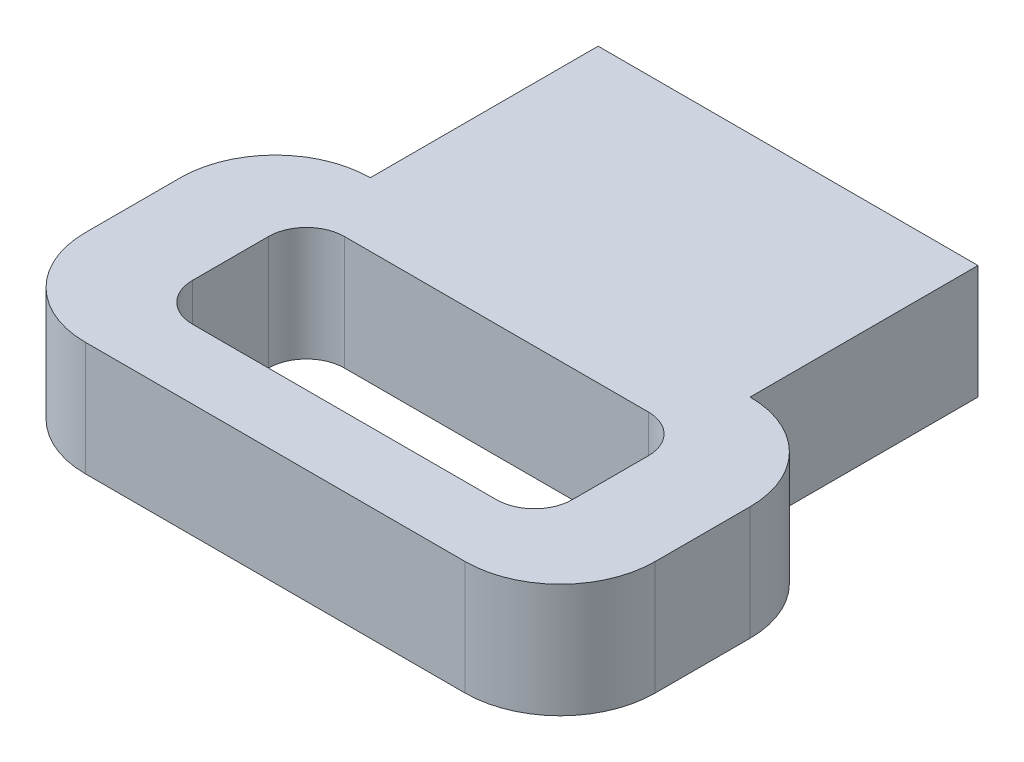
ISO-10303-21;
HEADER;
FILE_DESCRIPTION(('STEP AP214'),'2;1');
FILE_NAME('part.step','',(''),(''),'','','');
FILE_SCHEMA(('AUTOMOTIVE_DESIGN { 1 0 10303 214 1 1 1 1 }'));
ENDSEC;
DATA;
#1=APPLICATION_CONTEXT('core data for automotive mechanical design processes');
#2=APPLICATION_PROTOCOL_DEFINITION('international standard','automotive_design',2000,#1);
#3=PRODUCT_CONTEXT('',#1,'mechanical');
#4=PRODUCT('Part','Part','',(#3));
#5=PRODUCT_RELATED_PRODUCT_CATEGORY('part','',(#4));
#6=PRODUCT_DEFINITION_FORMATION('','',#4);
#7=PRODUCT_DEFINITION_CONTEXT('part definition',#1,'design');
#8=PRODUCT_DEFINITION('design','',#6,#7);
#9=PRODUCT_DEFINITION_SHAPE('','',#8);
#10=(LENGTH_UNIT() NAMED_UNIT(*) SI_UNIT(.MILLI.,.METRE.));
#11=(NAMED_UNIT(*) PLANE_ANGLE_UNIT() SI_UNIT($,.RADIAN.));
#12=(NAMED_UNIT(*) SI_UNIT($,.STERADIAN.) SOLID_ANGLE_UNIT());
#13=UNCERTAINTY_MEASURE_WITH_UNIT(LENGTH_MEASURE(1.E-05),#10,'distance_accuracy_value','');
#14=(GEOMETRIC_REPRESENTATION_CONTEXT(3) GLOBAL_UNCERTAINTY_ASSIGNED_CONTEXT((#13)) GLOBAL_UNIT_ASSIGNED_CONTEXT((#10,
#11,#12)) REPRESENTATION_CONTEXT('',''));
#15=CARTESIAN_POINT('',(0.,0.,0.));
#16=DIRECTION('',(0.,0.,1.));
#17=DIRECTION('',(1.,0.,0.));
#18=AXIS2_PLACEMENT_3D('',#15,#16,#17);
#19=CARTESIAN_POINT('',(-25.4,-7.62,30.48));
#20=DIRECTION('',(1.,0.,0.));
#21=DIRECTION('',(0.,0.,-1.));
#22=AXIS2_PLACEMENT_3D('',#19,#20,#21);
#23=PLANE('',#22);
#24=DIRECTION('',(0.,-1.,0.));
#25=VECTOR('',#24,1.);
#26=CARTESIAN_POINT('',(-25.4,-7.62,0.));
#27=LINE('',#26,#25);
#28=CARTESIAN_POINT('',(-25.4,7.62,0.));
#29=VERTEX_POINT('',#28);
#30=CARTESIAN_POINT('',(-25.4,-7.62,0.));
#31=VERTEX_POINT('',#30);
#32=EDGE_CURVE('E203',#29,#31,#27,.T.);
#33=ORIENTED_EDGE('',*,*,#32,.T.);
#34=DIRECTION('',(0.,0.,-1.));
#35=VECTOR('',#34,1.);
#36=CARTESIAN_POINT('',(-25.4,-7.62,30.48));
#37=LINE('',#36,#35);
#38=CARTESIAN_POINT('',(-25.4,-7.62,30.48));
#39=VERTEX_POINT('',#38);
#40=EDGE_CURVE('E211',#39,#31,#37,.T.);
#41=ORIENTED_EDGE('',*,*,#40,.F.);
#42=DIRECTION('',(0.,-1.,0.));
#43=VECTOR('',#42,1.);
#44=CARTESIAN_POINT('',(-25.4,-7.62,30.48));
#45=LINE('',#44,#43);
#46=CARTESIAN_POINT('',(-25.4,7.62,30.48));
#47=VERTEX_POINT('',#46);
#48=EDGE_CURVE('E195',#47,#39,#45,.T.);
#49=ORIENTED_EDGE('',*,*,#48,.F.);
#50=DIRECTION('',(0.,0.,-1.));
#51=VECTOR('',#50,1.);
#52=CARTESIAN_POINT('',(-25.4,7.62,30.48));
#53=LINE('',#52,#51);
#54=EDGE_CURVE('E191',#47,#29,#53,.T.);
#55=ORIENTED_EDGE('',*,*,#54,.T.);
#56=EDGE_LOOP('',(#33,#41,#49,#55));
#57=FACE_BOUND('',#56,.T.);
#58=ADVANCED_FACE('F43',(#57),#23,.F.);
#59=CARTESIAN_POINT('',(25.4,-7.61999999999999,30.48));
#60=DIRECTION('',(0.,1.,0.));
#61=DIRECTION('',(-1.,0.,0.));
#62=AXIS2_PLACEMENT_3D('',#59,#60,#61);
#63=PLANE('',#62);
#64=DIRECTION('',(1.,0.,0.));
#65=VECTOR('',#64,1.);
#66=CARTESIAN_POINT('',(-25.4,-7.62,39.0072628806336));
#67=LINE('',#66,#65);
#68=CARTESIAN_POINT('',(-20.32,-7.62,39.0072628806336));
#69=VERTEX_POINT('',#68);
#70=CARTESIAN_POINT('',(20.32,-7.61999999999999,39.0072628806336));
#71=VERTEX_POINT('',#70);
#72=EDGE_CURVE('E553',#69,#71,#67,.T.);
#73=ORIENTED_EDGE('',*,*,#72,.F.);
#74=CARTESIAN_POINT('',(-20.32,-7.61999999999999,44.0872628806336));
#75=DIRECTION('',(0.,1.,0.));
#76=DIRECTION('',(-1.,0.,0.));
#77=AXIS2_PLACEMENT_3D('',#74,#75,#76);
#78=CIRCLE('',#77,5.08);
#79=CARTESIAN_POINT('',(-25.4,-7.62,44.0872628806336));
#80=VERTEX_POINT('',#79);
#81=EDGE_CURVE('E238',#69,#80,#78,.T.);
#82=ORIENTED_EDGE('',*,*,#81,.T.);
#83=DIRECTION('',(0.,0.,-1.));
#84=VECTOR('',#83,1.);
#85=CARTESIAN_POINT('',(-25.4,-7.62,59.3272628806336));
#86=LINE('',#85,#84);
#87=CARTESIAN_POINT('',(-25.4,-7.62,54.2472628806336));
#88=VERTEX_POINT('',#87);
#89=EDGE_CURVE('E547',#88,#80,#86,.T.);
#90=ORIENTED_EDGE('',*,*,#89,.F.);
#91=CARTESIAN_POINT('',(-20.32,-7.61999999999999,54.2472628806336));
#92=DIRECTION('',(0.,1.,0.));
#93=DIRECTION('',(-1.,0.,0.));
#94=AXIS2_PLACEMENT_3D('',#91,#92,#93);
#95=CIRCLE('',#94,5.08);
#96=CARTESIAN_POINT('',(-20.32,-7.62,59.3272628806336));
#97=VERTEX_POINT('',#96);
#98=EDGE_CURVE('E246',#88,#97,#95,.T.);
#99=ORIENTED_EDGE('',*,*,#98,.T.);
#100=DIRECTION('',(1.,0.,0.));
#101=VECTOR('',#100,1.);
#102=CARTESIAN_POINT('',(-25.4,-7.62,59.3272628806336));
#103=LINE('',#102,#101);
#104=CARTESIAN_POINT('',(20.32,-7.61999999999999,59.3272628806336));
#105=VERTEX_POINT('',#104);
#106=EDGE_CURVE('E561',#97,#105,#103,.T.);
#107=ORIENTED_EDGE('',*,*,#106,.T.);
#108=CARTESIAN_POINT('',(20.32,-7.61999999999999,54.2472628806336));
#109=DIRECTION('',(0.,1.,0.));
#110=DIRECTION('',(-1.,0.,0.));
#111=AXIS2_PLACEMENT_3D('',#108,#109,#110);
#112=CIRCLE('',#111,5.08);
#113=CARTESIAN_POINT('',(25.4,-7.61999999999999,54.2472628806336));
#114=VERTEX_POINT('',#113);
#115=EDGE_CURVE('E242',#105,#114,#112,.T.);
#116=ORIENTED_EDGE('',*,*,#115,.T.);
#117=DIRECTION('',(0.,0.,-1.));
#118=VECTOR('',#117,1.);
#119=CARTESIAN_POINT('',(25.4,-7.61999999999999,59.3272628806336));
#120=LINE('',#119,#118);
#121=CARTESIAN_POINT('',(25.4,-7.61999999999999,44.0872628806336));
#122=VERTEX_POINT('',#121);
#123=EDGE_CURVE('E556',#114,#122,#120,.T.);
#124=ORIENTED_EDGE('',*,*,#123,.T.);
#125=CARTESIAN_POINT('',(20.32,-7.61999999999999,44.0872628806336));
#126=DIRECTION('',(0.,1.,0.));
#127=DIRECTION('',(-1.,0.,0.));
#128=AXIS2_PLACEMENT_3D('',#125,#126,#127);
#129=CIRCLE('',#128,5.08);
#130=EDGE_CURVE('E234',#122,#71,#129,.T.);
#131=ORIENTED_EDGE('',*,*,#130,.T.);
#132=EDGE_LOOP('',(#73,#82,#90,#99,#107,#116,#124,#131));
#133=FACE_BOUND('',#132,.T.);
#134=DIRECTION('',(0.,0.,-1.));
#135=VECTOR('',#134,1.);
#136=CARTESIAN_POINT('',(25.4,-7.61999999999999,30.48));
#137=LINE('',#136,#135);
#138=CARTESIAN_POINT('',(25.4,-7.61999999999999,30.48));
#139=VERTEX_POINT('',#138);
#140=CARTESIAN_POINT('',(25.4,-7.61999999999999,0.));
#141=VERTEX_POINT('',#140);
#142=EDGE_CURVE('E190',#139,#141,#137,.T.);
#143=ORIENTED_EDGE('',*,*,#142,.F.);
#144=CARTESIAN_POINT('',(25.4,-7.61999999999999,43.18));
#145=DIRECTION('',(0.,1.,0.));
#146=DIRECTION('',(-1.,0.,0.));
#147=AXIS2_PLACEMENT_3D('',#144,#145,#146);
#148=CIRCLE('',#147,12.7);
#149=CARTESIAN_POINT('',(38.1,-7.62000000000001,43.18));
#150=VERTEX_POINT('',#149);
#151=EDGE_CURVE('E194',#139,#150,#148,.F.);
#152=ORIENTED_EDGE('',*,*,#151,.T.);
#153=DIRECTION('',(0.,0.,-1.));
#154=VECTOR('',#153,1.);
#155=CARTESIAN_POINT('',(38.1,-7.62000000000001,68.58));
#156=LINE('',#155,#154);
#157=CARTESIAN_POINT('',(38.1,-7.62000000000001,55.88));
#158=VERTEX_POINT('',#157);
#159=EDGE_CURVE('E292',#158,#150,#156,.T.);
#160=ORIENTED_EDGE('',*,*,#159,.F.);
#161=CARTESIAN_POINT('',(25.4,-7.61999999999999,55.88));
#162=DIRECTION('',(0.,1.,0.));
#163=DIRECTION('',(-1.,0.,0.));
#164=AXIS2_PLACEMENT_3D('',#161,#162,#163);
#165=CIRCLE('',#164,12.7);
#166=CARTESIAN_POINT('',(25.4,-7.62000000000001,68.58));
#167=VERTEX_POINT('',#166);
#168=EDGE_CURVE('E261',#158,#167,#165,.F.);
#169=ORIENTED_EDGE('',*,*,#168,.T.);
#170=DIRECTION('',(1.,0.,0.));
#171=VECTOR('',#170,1.);
#172=CARTESIAN_POINT('',(-38.1,-7.62000000000001,68.58));
#173=LINE('',#172,#171);
#174=CARTESIAN_POINT('',(-25.4,-7.62000000000001,68.58));
#175=VERTEX_POINT('',#174);
#176=EDGE_CURVE('E286',#175,#167,#173,.T.);
#177=ORIENTED_EDGE('',*,*,#176,.F.);
#178=CARTESIAN_POINT('',(-25.4,-7.62,55.88));
#179=DIRECTION('',(0.,1.,0.));
#180=DIRECTION('',(-1.,0.,0.));
#181=AXIS2_PLACEMENT_3D('',#178,#179,#180);
#182=CIRCLE('',#181,12.7);
#183=CARTESIAN_POINT('',(-38.1,-7.62000000000001,55.88));
#184=VERTEX_POINT('',#183);
#185=EDGE_CURVE('E65',#175,#184,#182,.F.);
#186=ORIENTED_EDGE('',*,*,#185,.T.);
#187=DIRECTION('',(0.,0.,-1.));
#188=VECTOR('',#187,1.);
#189=CARTESIAN_POINT('',(-38.1,-7.62000000000001,68.58));
#190=LINE('',#189,#188);
#191=CARTESIAN_POINT('',(-38.1,-7.62000000000001,43.18));
#192=VERTEX_POINT('',#191);
#193=EDGE_CURVE('E275',#184,#192,#190,.T.);
#194=ORIENTED_EDGE('',*,*,#193,.T.);
#195=CARTESIAN_POINT('',(-25.4,-7.62,43.18));
#196=DIRECTION('',(0.,1.,0.));
#197=DIRECTION('',(-1.,0.,0.));
#198=AXIS2_PLACEMENT_3D('',#195,#196,#197);
#199=CIRCLE('',#198,12.7);
#200=EDGE_CURVE('E58',#192,#39,#199,.F.);
#201=ORIENTED_EDGE('',*,*,#200,.T.);
#202=ORIENTED_EDGE('',*,*,#40,.T.);
#203=DIRECTION('',(1.,0.,0.));
#204=VECTOR('',#203,1.);
#205=CARTESIAN_POINT('',(25.4,-7.61999999999999,0.));
#206=LINE('',#205,#204);
#207=EDGE_CURVE('E206',#31,#141,#206,.T.);
#208=ORIENTED_EDGE('',*,*,#207,.T.);
#209=EDGE_LOOP('',(#143,#152,#160,#169,#177,#186,#194,#201,#202,#208));
#210=FACE_BOUND('',#209,.T.);
#211=ADVANCED_FACE('F289',(#133,#210),#63,.F.);
#212=CARTESIAN_POINT('',(25.4,-7.61999999999999,30.48));
#213=DIRECTION('',(-1.,0.,0.));
#214=DIRECTION('',(0.,-1.,0.));
#215=AXIS2_PLACEMENT_3D('',#212,#213,#214);
#216=PLANE('',#215);
#217=DIRECTION('',(0.,1.,0.));
#218=VECTOR('',#217,1.);
#219=CARTESIAN_POINT('',(25.4,-7.61999999999999,0.));
#220=LINE('',#219,#218);
#221=CARTESIAN_POINT('',(25.4,7.62000000000001,0.));
#222=VERTEX_POINT('',#221);
#223=EDGE_CURVE('E189',#141,#222,#220,.T.);
#224=ORIENTED_EDGE('',*,*,#223,.T.);
#225=DIRECTION('',(0.,0.,-1.));
#226=VECTOR('',#225,1.);
#227=CARTESIAN_POINT('',(25.4,7.62000000000001,30.48));
#228=LINE('',#227,#226);
#229=CARTESIAN_POINT('',(25.4,7.62000000000001,30.48));
#230=VERTEX_POINT('',#229);
#231=EDGE_CURVE('E172',#230,#222,#228,.T.);
#232=ORIENTED_EDGE('',*,*,#231,.F.);
#233=DIRECTION('',(0.,1.,0.));
#234=VECTOR('',#233,1.);
#235=CARTESIAN_POINT('',(25.4,-7.61999999999999,30.48));
#236=LINE('',#235,#234);
#237=EDGE_CURVE('E186',#139,#230,#236,.T.);
#238=ORIENTED_EDGE('',*,*,#237,.F.);
#239=ORIENTED_EDGE('',*,*,#142,.T.);
#240=EDGE_LOOP('',(#224,#232,#238,#239));
#241=FACE_BOUND('',#240,.T.);
#242=ADVANCED_FACE('F184',(#241),#216,.F.);
#243=CARTESIAN_POINT('',(25.4,7.62000000000001,30.48));
#244=DIRECTION('',(0.,-1.,0.));
#245=DIRECTION('',(1.,0.,0.));
#246=AXIS2_PLACEMENT_3D('',#243,#244,#245);
#247=PLANE('',#246);
#248=DIRECTION('',(1.,0.,0.));
#249=VECTOR('',#248,1.);
#250=CARTESIAN_POINT('',(-25.4,7.62000000000001,59.3272628806336));
#251=LINE('',#250,#249);
#252=CARTESIAN_POINT('',(-20.32,7.62000000000001,59.3272628806336));
#253=VERTEX_POINT('',#252);
#254=CARTESIAN_POINT('',(20.32,7.62000000000001,59.3272628806336));
#255=VERTEX_POINT('',#254);
#256=EDGE_CURVE('E296',#253,#255,#251,.T.);
#257=ORIENTED_EDGE('',*,*,#256,.F.);
#258=CARTESIAN_POINT('',(-20.32,7.62,54.2472628806336));
#259=DIRECTION('',(0.,-1.,0.));
#260=DIRECTION('',(1.,0.,0.));
#261=AXIS2_PLACEMENT_3D('',#258,#259,#260);
#262=CIRCLE('',#261,5.08);
#263=CARTESIAN_POINT('',(-25.4,7.62000000000001,54.2472628806336));
#264=VERTEX_POINT('',#263);
#265=EDGE_CURVE('E248',#253,#264,#262,.T.);
#266=ORIENTED_EDGE('',*,*,#265,.T.);
#267=DIRECTION('',(0.,0.,-1.));
#268=VECTOR('',#267,1.);
#269=CARTESIAN_POINT('',(-25.4,7.62000000000001,59.3272628806336));
#270=LINE('',#269,#268);
#271=CARTESIAN_POINT('',(-25.4,7.62000000000001,44.0872628806336));
#272=VERTEX_POINT('',#271);
#273=EDGE_CURVE('E549',#264,#272,#270,.T.);
#274=ORIENTED_EDGE('',*,*,#273,.T.);
#275=CARTESIAN_POINT('',(-20.32,7.62,44.0872628806336));
#276=DIRECTION('',(0.,-1.,0.));
#277=DIRECTION('',(1.,0.,0.));
#278=AXIS2_PLACEMENT_3D('',#275,#276,#277);
#279=CIRCLE('',#278,5.08);
#280=CARTESIAN_POINT('',(-20.32,7.62000000000001,39.0072628806336));
#281=VERTEX_POINT('',#280);
#282=EDGE_CURVE('E240',#272,#281,#279,.T.);
#283=ORIENTED_EDGE('',*,*,#282,.T.);
#284=DIRECTION('',(1.,0.,0.));
#285=VECTOR('',#284,1.);
#286=CARTESIAN_POINT('',(-25.4,7.62000000000001,39.0072628806336));
#287=LINE('',#286,#285);
#288=CARTESIAN_POINT('',(20.32,7.62000000000001,39.0072628806336));
#289=VERTEX_POINT('',#288);
#290=EDGE_CURVE('E562',#281,#289,#287,.T.);
#291=ORIENTED_EDGE('',*,*,#290,.T.);
#292=CARTESIAN_POINT('',(20.32,7.62000000000001,44.0872628806336));
#293=DIRECTION('',(0.,-1.,0.));
#294=DIRECTION('',(1.,0.,0.));
#295=AXIS2_PLACEMENT_3D('',#292,#293,#294);
#296=CIRCLE('',#295,5.08);
#297=CARTESIAN_POINT('',(25.4,7.62000000000001,44.0872628806336));
#298=VERTEX_POINT('',#297);
#299=EDGE_CURVE('E236',#289,#298,#296,.T.);
#300=ORIENTED_EDGE('',*,*,#299,.T.);
#301=DIRECTION('',(0.,0.,-1.));
#302=VECTOR('',#301,1.);
#303=CARTESIAN_POINT('',(25.4,7.62000000000001,59.3272628806336));
#304=LINE('',#303,#302);
#305=CARTESIAN_POINT('',(25.4,7.62000000000001,54.2472628806336));
#306=VERTEX_POINT('',#305);
#307=EDGE_CURVE('E541',#306,#298,#304,.T.);
#308=ORIENTED_EDGE('',*,*,#307,.F.);
#309=CARTESIAN_POINT('',(20.32,7.62000000000001,54.2472628806336));
#310=DIRECTION('',(0.,-1.,0.));
#311=DIRECTION('',(1.,0.,0.));
#312=AXIS2_PLACEMENT_3D('',#309,#310,#311);
#313=CIRCLE('',#312,5.08);
#314=EDGE_CURVE('E244',#306,#255,#313,.T.);
#315=ORIENTED_EDGE('',*,*,#314,.T.);
#316=EDGE_LOOP('',(#257,#266,#274,#283,#291,#300,#308,#315));
#317=FACE_BOUND('',#316,.T.);
#318=DIRECTION('',(0.,0.,-1.));
#319=VECTOR('',#318,1.);
#320=CARTESIAN_POINT('',(38.1,7.62000000000001,68.58));
#321=LINE('',#320,#319);
#322=CARTESIAN_POINT('',(38.1,7.62000000000001,55.88));
#323=VERTEX_POINT('',#322);
#324=CARTESIAN_POINT('',(38.1,7.62000000000001,43.18));
#325=VERTEX_POINT('',#324);
#326=EDGE_CURVE('E175',#323,#325,#321,.T.);
#327=ORIENTED_EDGE('',*,*,#326,.T.);
#328=CARTESIAN_POINT('',(25.4,7.62000000000001,43.18));
#329=DIRECTION('',(0.,-1.,0.));
#330=DIRECTION('',(1.,0.,0.));
#331=AXIS2_PLACEMENT_3D('',#328,#329,#330);
#332=CIRCLE('',#331,12.7);
#333=EDGE_CURVE('E169',#325,#230,#332,.F.);
#334=ORIENTED_EDGE('',*,*,#333,.T.);
#335=ORIENTED_EDGE('',*,*,#231,.T.);
#336=DIRECTION('',(-1.,0.,0.));
#337=VECTOR('',#336,1.);
#338=CARTESIAN_POINT('',(25.4,7.62000000000001,0.));
#339=LINE('',#338,#337);
#340=EDGE_CURVE('E199',#222,#29,#339,.T.);
#341=ORIENTED_EDGE('',*,*,#340,.T.);
#342=ORIENTED_EDGE('',*,*,#54,.F.);
#343=CARTESIAN_POINT('',(-25.4,7.62,43.18));
#344=DIRECTION('',(0.,-1.,0.));
#345=DIRECTION('',(1.,0.,0.));
#346=AXIS2_PLACEMENT_3D('',#343,#344,#345);
#347=CIRCLE('',#346,12.7);
#348=CARTESIAN_POINT('',(-38.1,7.62000000000001,43.18));
#349=VERTEX_POINT('',#348);
#350=EDGE_CURVE('E256',#47,#349,#347,.F.);
#351=ORIENTED_EDGE('',*,*,#350,.T.);
#352=DIRECTION('',(0.,0.,-1.));
#353=VECTOR('',#352,1.);
#354=CARTESIAN_POINT('',(-38.1,7.62000000000001,68.58));
#355=LINE('',#354,#353);
#356=CARTESIAN_POINT('',(-38.1,7.62000000000001,55.88));
#357=VERTEX_POINT('',#356);
#358=EDGE_CURVE('E274',#357,#349,#355,.T.);
#359=ORIENTED_EDGE('',*,*,#358,.F.);
#360=CARTESIAN_POINT('',(-25.4,7.62,55.88));
#361=DIRECTION('',(0.,-1.,0.));
#362=DIRECTION('',(1.,0.,0.));
#363=AXIS2_PLACEMENT_3D('',#360,#361,#362);
#364=CIRCLE('',#363,12.7);
#365=CARTESIAN_POINT('',(-25.4,7.62000000000001,68.58));
#366=VERTEX_POINT('',#365);
#367=EDGE_CURVE('E254',#357,#366,#364,.F.);
#368=ORIENTED_EDGE('',*,*,#367,.T.);
#369=DIRECTION('',(-1.,0.,0.));
#370=VECTOR('',#369,1.);
#371=CARTESIAN_POINT('',(-38.1,7.62000000000001,68.58));
#372=LINE('',#371,#370);
#373=CARTESIAN_POINT('',(25.4,7.62000000000001,68.58));
#374=VERTEX_POINT('',#373);
#375=EDGE_CURVE('E288',#374,#366,#372,.T.);
#376=ORIENTED_EDGE('',*,*,#375,.F.);
#377=CARTESIAN_POINT('',(25.4,7.62000000000001,55.88));
#378=DIRECTION('',(0.,-1.,0.));
#379=DIRECTION('',(1.,0.,0.));
#380=AXIS2_PLACEMENT_3D('',#377,#378,#379);
#381=CIRCLE('',#380,12.7);
#382=EDGE_CURVE('E180',#374,#323,#381,.F.);
#383=ORIENTED_EDGE('',*,*,#382,.T.);
#384=EDGE_LOOP('',(#327,#334,#335,#341,#342,#351,#359,#368,#376,#383));
#385=FACE_BOUND('',#384,.T.);
#386=ADVANCED_FACE('F171',(#317,#385),#247,.F.);
#387=CARTESIAN_POINT('',(0.,0.,0.));
#388=DIRECTION('',(0.,0.,1.));
#389=DIRECTION('',(1.,0.,0.));
#390=AXIS2_PLACEMENT_3D('',#387,#388,#389);
#391=PLANE('',#390);
#392=ORIENTED_EDGE('',*,*,#32,.F.);
#393=ORIENTED_EDGE('',*,*,#340,.F.);
#394=ORIENTED_EDGE('',*,*,#223,.F.);
#395=ORIENTED_EDGE('',*,*,#207,.F.);
#396=EDGE_LOOP('',(#392,#393,#394,#395));
#397=FACE_BOUND('',#396,.T.);
#398=ADVANCED_FACE('F456',(#397),#391,.F.);
#399=CARTESIAN_POINT('',(38.1,-7.62000000000001,68.58));
#400=DIRECTION('',(-1.,0.,0.));
#401=DIRECTION('',(0.,0.,1.));
#402=AXIS2_PLACEMENT_3D('',#399,#400,#401);
#403=PLANE('',#402);
#404=ORIENTED_EDGE('',*,*,#159,.T.);
#405=DIRECTION('',(0.,1.,0.));
#406=VECTOR('',#405,1.);
#407=CARTESIAN_POINT('',(38.1,7.62000000000001,43.18));
#408=LINE('',#407,#406);
#409=EDGE_CURVE('E252',#150,#325,#408,.T.);
#410=ORIENTED_EDGE('',*,*,#409,.T.);
#411=ORIENTED_EDGE('',*,*,#326,.F.);
#412=DIRECTION('',(0.,1.,0.));
#413=VECTOR('',#412,1.);
#414=CARTESIAN_POINT('',(38.1,-7.62000000000001,55.88));
#415=LINE('',#414,#413);
#416=EDGE_CURVE('E250',#323,#158,#415,.F.);
#417=ORIENTED_EDGE('',*,*,#416,.T.);
#418=EDGE_LOOP('',(#404,#410,#411,#417));
#419=FACE_BOUND('',#418,.T.);
#420=ADVANCED_FACE('F447',(#419),#403,.F.);
#421=CARTESIAN_POINT('',(-38.1,-7.62000000000001,68.58));
#422=DIRECTION('',(1.,0.,0.));
#423=DIRECTION('',(0.,0.,-1.));
#424=AXIS2_PLACEMENT_3D('',#421,#422,#423);
#425=PLANE('',#424);
#426=ORIENTED_EDGE('',*,*,#358,.T.);
#427=DIRECTION('',(0.,-1.,0.));
#428=VECTOR('',#427,1.);
#429=CARTESIAN_POINT('',(-38.1,-7.62000000000001,43.18));
#430=LINE('',#429,#428);
#431=EDGE_CURVE('E11',#349,#192,#430,.T.);
#432=ORIENTED_EDGE('',*,*,#431,.T.);
#433=ORIENTED_EDGE('',*,*,#193,.F.);
#434=DIRECTION('',(0.,-1.,0.));
#435=VECTOR('',#434,1.);
#436=CARTESIAN_POINT('',(-38.1,-7.62000000000001,55.88));
#437=LINE('',#436,#435);
#438=EDGE_CURVE('E51',#184,#357,#437,.F.);
#439=ORIENTED_EDGE('',*,*,#438,.T.);
#440=EDGE_LOOP('',(#426,#432,#433,#439));
#441=FACE_BOUND('',#440,.T.);
#442=ADVANCED_FACE('F273',(#441),#425,.F.);
#443=CARTESIAN_POINT('',(0.,0.,68.58));
#444=DIRECTION('',(0.,0.,-1.));
#445=DIRECTION('',(-1.,0.,0.));
#446=AXIS2_PLACEMENT_3D('',#443,#444,#445);
#447=PLANE('',#446);
#448=ORIENTED_EDGE('',*,*,#176,.T.);
#449=DIRECTION('',(0.,1.,0.));
#450=VECTOR('',#449,1.);
#451=CARTESIAN_POINT('',(25.4,0.,68.58));
#452=LINE('',#451,#450);
#453=EDGE_CURVE('E267',#167,#374,#452,.T.);
#454=ORIENTED_EDGE('',*,*,#453,.T.);
#455=ORIENTED_EDGE('',*,*,#375,.T.);
#456=DIRECTION('',(0.,-1.,0.));
#457=VECTOR('',#456,1.);
#458=CARTESIAN_POINT('',(-25.4,0.,68.58));
#459=LINE('',#458,#457);
#460=EDGE_CURVE('E264',#366,#175,#459,.T.);
#461=ORIENTED_EDGE('',*,*,#460,.T.);
#462=EDGE_LOOP('',(#448,#454,#455,#461));
#463=FACE_BOUND('',#462,.T.);
#464=ADVANCED_FACE('F285',(#463),#447,.F.);
#465=CARTESIAN_POINT('',(-25.4,7.62000000000001,59.3272628806336));
#466=DIRECTION('',(-1.,0.,0.));
#467=DIRECTION('',(0.,-1.,0.));
#468=AXIS2_PLACEMENT_3D('',#465,#466,#467);
#469=PLANE('',#468);
#470=ORIENTED_EDGE('',*,*,#89,.T.);
#471=DIRECTION('',(0.,-1.,0.));
#472=VECTOR('',#471,1.);
#473=CARTESIAN_POINT('',(-25.4,7.62000000000001,44.0872628806336));
#474=LINE('',#473,#472);
#475=EDGE_CURVE('E227',#80,#272,#474,.F.);
#476=ORIENTED_EDGE('',*,*,#475,.T.);
#477=ORIENTED_EDGE('',*,*,#273,.F.);
#478=DIRECTION('',(0.,-1.,0.));
#479=VECTOR('',#478,1.);
#480=CARTESIAN_POINT('',(-25.4,7.62000000000001,54.2472628806336));
#481=LINE('',#480,#479);
#482=EDGE_CURVE('E224',#264,#88,#481,.T.);
#483=ORIENTED_EDGE('',*,*,#482,.T.);
#484=EDGE_LOOP('',(#470,#476,#477,#483));
#485=FACE_BOUND('',#484,.T.);
#486=ADVANCED_FACE('F421',(#485),#469,.F.);
#487=CARTESIAN_POINT('',(-25.4,7.62000000000001,59.3272628806336));
#488=DIRECTION('',(0.,0.,-1.));
#489=DIRECTION('',(-1.,0.,0.));
#490=AXIS2_PLACEMENT_3D('',#487,#488,#489);
#491=PLANE('',#490);
#492=ORIENTED_EDGE('',*,*,#256,.T.);
#493=DIRECTION('',(0.,-1.,0.));
#494=VECTOR('',#493,1.);
#495=CARTESIAN_POINT('',(20.32,-7.61999999999999,59.3272628806336));
#496=LINE('',#495,#494);
#497=EDGE_CURVE('E231',#255,#105,#496,.T.);
#498=ORIENTED_EDGE('',*,*,#497,.T.);
#499=ORIENTED_EDGE('',*,*,#106,.F.);
#500=DIRECTION('',(0.,-1.,0.));
#501=VECTOR('',#500,1.);
#502=CARTESIAN_POINT('',(-20.32,7.62000000000001,59.3272628806336));
#503=LINE('',#502,#501);
#504=EDGE_CURVE('E229',#97,#253,#503,.F.);
#505=ORIENTED_EDGE('',*,*,#504,.T.);
#506=EDGE_LOOP('',(#492,#498,#499,#505));
#507=FACE_BOUND('',#506,.T.);
#508=ADVANCED_FACE('F411',(#507),#491,.T.);
#509=CARTESIAN_POINT('',(25.4,7.62000000000001,59.3272628806336));
#510=DIRECTION('',(-1.,0.,0.));
#511=DIRECTION('',(0.,0.,1.));
#512=AXIS2_PLACEMENT_3D('',#509,#510,#511);
#513=PLANE('',#512);
#514=ORIENTED_EDGE('',*,*,#307,.T.);
#515=DIRECTION('',(0.,-1.,0.));
#516=VECTOR('',#515,1.);
#517=CARTESIAN_POINT('',(25.4,7.62000000000001,44.0872628806336));
#518=LINE('',#517,#516);
#519=EDGE_CURVE('E216',#298,#122,#518,.T.);
#520=ORIENTED_EDGE('',*,*,#519,.T.);
#521=ORIENTED_EDGE('',*,*,#123,.F.);
#522=DIRECTION('',(0.,-1.,0.));
#523=VECTOR('',#522,1.);
#524=CARTESIAN_POINT('',(25.4,7.62000000000001,54.2472628806336));
#525=LINE('',#524,#523);
#526=EDGE_CURVE('E214',#114,#306,#525,.F.);
#527=ORIENTED_EDGE('',*,*,#526,.T.);
#528=EDGE_LOOP('',(#514,#520,#521,#527));
#529=FACE_BOUND('',#528,.T.);
#530=ADVANCED_FACE('F401',(#529),#513,.T.);
#531=CARTESIAN_POINT('',(-25.4,7.62000000000001,39.0072628806336));
#532=DIRECTION('',(0.,0.,-1.));
#533=DIRECTION('',(-1.,0.,0.));
#534=AXIS2_PLACEMENT_3D('',#531,#532,#533);
#535=PLANE('',#534);
#536=ORIENTED_EDGE('',*,*,#72,.T.);
#537=DIRECTION('',(0.,-1.,0.));
#538=VECTOR('',#537,1.);
#539=CARTESIAN_POINT('',(20.32,7.62000000000001,39.0072628806336));
#540=LINE('',#539,#538);
#541=EDGE_CURVE('E222',#71,#289,#540,.F.);
#542=ORIENTED_EDGE('',*,*,#541,.T.);
#543=ORIENTED_EDGE('',*,*,#290,.F.);
#544=DIRECTION('',(0.,-1.,0.));
#545=VECTOR('',#544,1.);
#546=CARTESIAN_POINT('',(-20.32,-7.62,39.0072628806336));
#547=LINE('',#546,#545);
#548=EDGE_CURVE('E219',#281,#69,#547,.T.);
#549=ORIENTED_EDGE('',*,*,#548,.T.);
#550=EDGE_LOOP('',(#536,#542,#543,#549));
#551=FACE_BOUND('',#550,.T.);
#552=ADVANCED_FACE('F326',(#551),#535,.F.);
#553=CARTESIAN_POINT('',(20.32,7.62000000000001,44.0872628806336));
#554=DIRECTION('',(0.,-1.,0.));
#555=DIRECTION('',(1.,0.,0.));
#556=AXIS2_PLACEMENT_3D('',#553,#554,#555);
#557=CYLINDRICAL_SURFACE('',#556,5.08);
#558=ORIENTED_EDGE('',*,*,#299,.F.);
#559=ORIENTED_EDGE('',*,*,#541,.F.);
#560=ORIENTED_EDGE('',*,*,#130,.F.);
#561=ORIENTED_EDGE('',*,*,#519,.F.);
#562=EDGE_LOOP('',(#558,#559,#560,#561));
#563=FACE_BOUND('',#562,.T.);
#564=ADVANCED_FACE('F322',(#563),#557,.F.);
#565=CARTESIAN_POINT('',(-20.32,7.62000000000001,44.0872628806336));
#566=DIRECTION('',(0.,1.,0.));
#567=DIRECTION('',(-1.,0.,0.));
#568=AXIS2_PLACEMENT_3D('',#565,#566,#567);
#569=CYLINDRICAL_SURFACE('',#568,5.08);
#570=ORIENTED_EDGE('',*,*,#282,.F.);
#571=ORIENTED_EDGE('',*,*,#475,.F.);
#572=ORIENTED_EDGE('',*,*,#81,.F.);
#573=ORIENTED_EDGE('',*,*,#548,.F.);
#574=EDGE_LOOP('',(#570,#571,#572,#573));
#575=FACE_BOUND('',#574,.T.);
#576=ADVANCED_FACE('F325',(#575),#569,.F.);
#577=CARTESIAN_POINT('',(20.32,7.62000000000001,54.2472628806336));
#578=DIRECTION('',(0.,1.,0.));
#579=DIRECTION('',(-1.,0.,0.));
#580=AXIS2_PLACEMENT_3D('',#577,#578,#579);
#581=CYLINDRICAL_SURFACE('',#580,5.08);
#582=ORIENTED_EDGE('',*,*,#314,.F.);
#583=ORIENTED_EDGE('',*,*,#526,.F.);
#584=ORIENTED_EDGE('',*,*,#115,.F.);
#585=ORIENTED_EDGE('',*,*,#497,.F.);
#586=EDGE_LOOP('',(#582,#583,#584,#585));
#587=FACE_BOUND('',#586,.T.);
#588=ADVANCED_FACE('F330',(#587),#581,.F.);
#589=CARTESIAN_POINT('',(-20.32,7.62000000000001,54.2472628806336));
#590=DIRECTION('',(0.,-1.,0.));
#591=DIRECTION('',(1.,0.,0.));
#592=AXIS2_PLACEMENT_3D('',#589,#590,#591);
#593=CYLINDRICAL_SURFACE('',#592,5.08);
#594=ORIENTED_EDGE('',*,*,#265,.F.);
#595=ORIENTED_EDGE('',*,*,#504,.F.);
#596=ORIENTED_EDGE('',*,*,#98,.F.);
#597=ORIENTED_EDGE('',*,*,#482,.F.);
#598=EDGE_LOOP('',(#594,#595,#596,#597));
#599=FACE_BOUND('',#598,.T.);
#600=ADVANCED_FACE('F334',(#599),#593,.F.);
#601=CARTESIAN_POINT('',(25.4,-7.62000000000001,43.18));
#602=DIRECTION('',(0.,-1.,0.));
#603=DIRECTION('',(0.,0.,-1.));
#604=AXIS2_PLACEMENT_3D('',#601,#602,#603);
#605=CYLINDRICAL_SURFACE('',#604,12.7);
#606=ORIENTED_EDGE('',*,*,#151,.F.);
#607=ORIENTED_EDGE('',*,*,#237,.T.);
#608=ORIENTED_EDGE('',*,*,#333,.F.);
#609=ORIENTED_EDGE('',*,*,#409,.F.);
#610=EDGE_LOOP('',(#606,#607,#608,#609));
#611=FACE_BOUND('',#610,.T.);
#612=ADVANCED_FACE('F193',(#611),#605,.T.);
#613=CARTESIAN_POINT('',(25.4,0.,55.88));
#614=DIRECTION('',(0.,1.,0.));
#615=DIRECTION('',(0.,0.,1.));
#616=AXIS2_PLACEMENT_3D('',#613,#614,#615);
#617=CYLINDRICAL_SURFACE('',#616,12.7);
#618=ORIENTED_EDGE('',*,*,#168,.F.);
#619=ORIENTED_EDGE('',*,*,#416,.F.);
#620=ORIENTED_EDGE('',*,*,#382,.F.);
#621=ORIENTED_EDGE('',*,*,#453,.F.);
#622=EDGE_LOOP('',(#618,#619,#620,#621));
#623=FACE_BOUND('',#622,.T.);
#624=ADVANCED_FACE('F306',(#623),#617,.T.);
#625=CARTESIAN_POINT('',(-25.4,-7.62000000000001,43.18));
#626=DIRECTION('',(0.,1.,0.));
#627=DIRECTION('',(0.,0.,1.));
#628=AXIS2_PLACEMENT_3D('',#625,#626,#627);
#629=CYLINDRICAL_SURFACE('',#628,12.7);
#630=ORIENTED_EDGE('',*,*,#350,.F.);
#631=ORIENTED_EDGE('',*,*,#48,.T.);
#632=ORIENTED_EDGE('',*,*,#200,.F.);
#633=ORIENTED_EDGE('',*,*,#431,.F.);
#634=EDGE_LOOP('',(#630,#631,#632,#633));
#635=FACE_BOUND('',#634,.T.);
#636=ADVANCED_FACE('F304',(#635),#629,.T.);
#637=CARTESIAN_POINT('',(-25.4,0.,55.88));
#638=DIRECTION('',(0.,-1.,0.));
#639=DIRECTION('',(0.,0.,-1.));
#640=AXIS2_PLACEMENT_3D('',#637,#638,#639);
#641=CYLINDRICAL_SURFACE('',#640,12.7);
#642=ORIENTED_EDGE('',*,*,#367,.F.);
#643=ORIENTED_EDGE('',*,*,#438,.F.);
#644=ORIENTED_EDGE('',*,*,#185,.F.);
#645=ORIENTED_EDGE('',*,*,#460,.F.);
#646=EDGE_LOOP('',(#642,#643,#644,#645));
#647=FACE_BOUND('',#646,.T.);
#648=ADVANCED_FACE('F45',(#647),#641,.T.);
#649=CLOSED_SHELL('',(#58,#211,#242,#386,#398,#420,#442,#464,#486,#508,#530,#552,#564,#576,#588,
#600,#612,#624,#636,#648));
#650=MANIFOLD_SOLID_BREP('B2',#649);
#651=ADVANCED_BREP_SHAPE_REPRESENTATION('',(#18,#650),#14);
#652=SHAPE_DEFINITION_REPRESENTATION(#9,#651);
ENDSEC;
END-ISO-10303-21;
